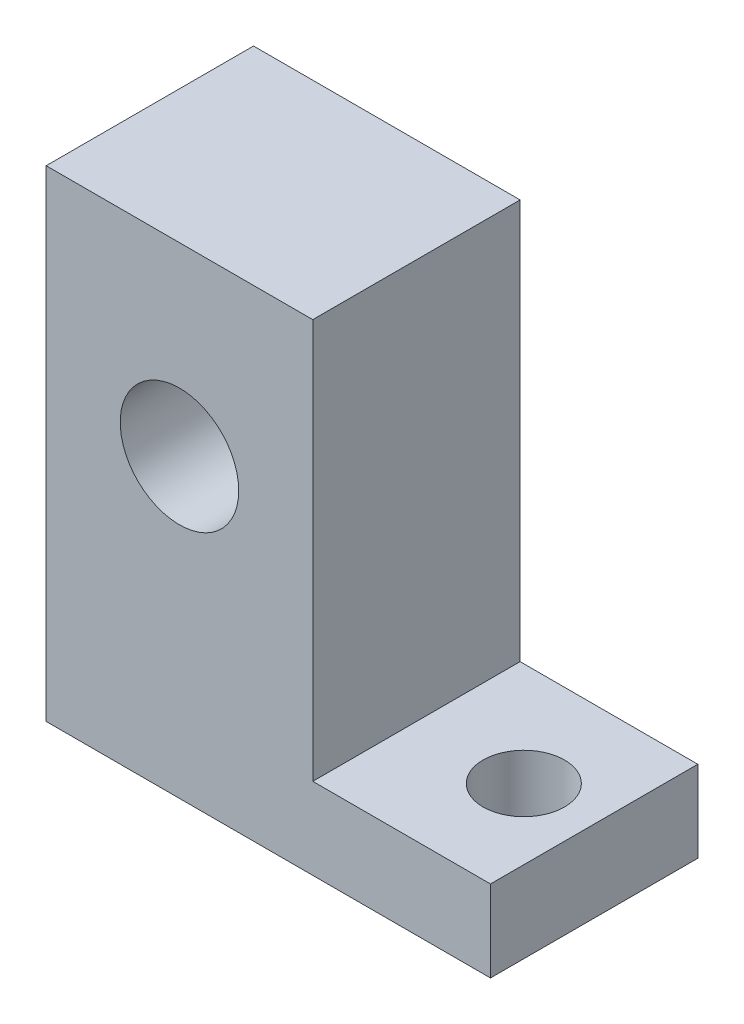
ISO-10303-21;
HEADER;
FILE_DESCRIPTION(('STEP AP214'),'2;1');
FILE_NAME('part.step','',(''),(''),'','','');
FILE_SCHEMA(('AUTOMOTIVE_DESIGN { 1 0 10303 214 1 1 1 1 }'));
ENDSEC;
DATA;
#1=APPLICATION_CONTEXT('core data for automotive mechanical design processes');
#2=APPLICATION_PROTOCOL_DEFINITION('international standard','automotive_design',2000,#1);
#3=PRODUCT_CONTEXT('',#1,'mechanical');
#4=PRODUCT('Part','Part','',(#3));
#5=PRODUCT_RELATED_PRODUCT_CATEGORY('part','',(#4));
#6=PRODUCT_DEFINITION_FORMATION('','',#4);
#7=PRODUCT_DEFINITION_CONTEXT('part definition',#1,'design');
#8=PRODUCT_DEFINITION('design','',#6,#7);
#9=PRODUCT_DEFINITION_SHAPE('','',#8);
#10=(LENGTH_UNIT() NAMED_UNIT(*) SI_UNIT(.MILLI.,.METRE.));
#11=(NAMED_UNIT(*) PLANE_ANGLE_UNIT() SI_UNIT($,.RADIAN.));
#12=(NAMED_UNIT(*) SI_UNIT($,.STERADIAN.) SOLID_ANGLE_UNIT());
#13=UNCERTAINTY_MEASURE_WITH_UNIT(LENGTH_MEASURE(1.E-05),#10,'distance_accuracy_value','');
#14=(GEOMETRIC_REPRESENTATION_CONTEXT(3) GLOBAL_UNCERTAINTY_ASSIGNED_CONTEXT((#13)) GLOBAL_UNIT_ASSIGNED_CONTEXT((#10,
#11,#12)) REPRESENTATION_CONTEXT('',''));
#15=CARTESIAN_POINT('',(0.,0.,0.));
#16=DIRECTION('',(0.,0.,1.));
#17=DIRECTION('',(1.,0.,0.));
#18=AXIS2_PLACEMENT_3D('',#15,#16,#17);
#19=CARTESIAN_POINT('',(0.,0.,14.));
#20=DIRECTION('',(0.,0.,-1.));
#21=DIRECTION('',(-1.,0.,0.));
#22=AXIS2_PLACEMENT_3D('',#19,#20,#21);
#23=PLANE('',#22);
#24=DIRECTION('',(0.,-1.,0.));
#25=VECTOR('',#24,1.);
#26=CARTESIAN_POINT('',(-9.,-10.75,14.));
#27=LINE('',#26,#25);
#28=CARTESIAN_POINT('',(-9.,16.25,14.));
#29=VERTEX_POINT('',#28);
#30=CARTESIAN_POINT('',(-9.,-16.25,14.));
#31=VERTEX_POINT('',#30);
#32=EDGE_CURVE('E111',#29,#31,#27,.T.);
#33=ORIENTED_EDGE('',*,*,#32,.T.);
#34=DIRECTION('',(1.,0.,0.));
#35=VECTOR('',#34,1.);
#36=CARTESIAN_POINT('',(-21.,-16.25,14.));
#37=LINE('',#36,#35);
#38=CARTESIAN_POINT('',(21.,-16.25,14.));
#39=VERTEX_POINT('',#38);
#40=EDGE_CURVE('E85',#31,#39,#37,.T.);
#41=ORIENTED_EDGE('',*,*,#40,.T.);
#42=DIRECTION('',(0.,1.,0.));
#43=VECTOR('',#42,1.);
#44=CARTESIAN_POINT('',(21.,-16.25,14.));
#45=LINE('',#44,#43);
#46=CARTESIAN_POINT('',(21.,-10.75,14.));
#47=VERTEX_POINT('',#46);
#48=EDGE_CURVE('E98',#39,#47,#45,.T.);
#49=ORIENTED_EDGE('',*,*,#48,.T.);
#50=DIRECTION('',(-1.,0.,0.));
#51=VECTOR('',#50,1.);
#52=CARTESIAN_POINT('',(21.,-10.75,14.));
#53=LINE('',#52,#51);
#54=CARTESIAN_POINT('',(8.99999999999999,-10.75,14.));
#55=VERTEX_POINT('',#54);
#56=EDGE_CURVE('E92',#47,#55,#53,.T.);
#57=ORIENTED_EDGE('',*,*,#56,.T.);
#58=DIRECTION('',(0.,1.,0.));
#59=VECTOR('',#58,1.);
#60=CARTESIAN_POINT('',(8.99999999999999,-10.75,14.));
#61=LINE('',#60,#59);
#62=CARTESIAN_POINT('',(8.99999999999999,16.25,14.));
#63=VERTEX_POINT('',#62);
#64=EDGE_CURVE('E96',#55,#63,#61,.T.);
#65=ORIENTED_EDGE('',*,*,#64,.T.);
#66=DIRECTION('',(-1.,0.,0.));
#67=VECTOR('',#66,1.);
#68=CARTESIAN_POINT('',(-9.,16.25,14.));
#69=LINE('',#68,#67);
#70=EDGE_CURVE('E51',#63,#29,#69,.T.);
#71=ORIENTED_EDGE('',*,*,#70,.T.);
#72=EDGE_LOOP('',(#33,#41,#49,#57,#65,#71));
#73=FACE_BOUND('',#72,.T.);
#74=CARTESIAN_POINT('',(0.,3.74999999999999,14.));
#75=DIRECTION('',(0.,0.,1.));
#76=DIRECTION('',(1.,0.,0.));
#77=AXIS2_PLACEMENT_3D('',#74,#75,#76);
#78=CIRCLE('',#77,4.);
#79=CARTESIAN_POINT('',(3.99999999999999,3.74999999999999,14.));
#80=VERTEX_POINT('',#79);
#81=EDGE_CURVE('E120',#80,#80,#78,.T.);
#82=ORIENTED_EDGE('',*,*,#81,.F.);
#83=EDGE_LOOP('',(#82));
#84=FACE_BOUND('',#83,.T.);
#85=ADVANCED_FACE('F34',(#73,#84),#23,.F.);
#86=CARTESIAN_POINT('',(0.,0.,0.));
#87=DIRECTION('',(0.,0.,-1.));
#88=DIRECTION('',(-1.,0.,0.));
#89=AXIS2_PLACEMENT_3D('',#86,#87,#88);
#90=PLANE('',#89);
#91=DIRECTION('',(1.,0.,0.));
#92=VECTOR('',#91,1.);
#93=CARTESIAN_POINT('',(-21.,-16.25,0.));
#94=LINE('',#93,#92);
#95=CARTESIAN_POINT('',(-9.,-16.25,0.));
#96=VERTEX_POINT('',#95);
#97=CARTESIAN_POINT('',(21.,-16.25,0.));
#98=VERTEX_POINT('',#97);
#99=EDGE_CURVE('E117',#96,#98,#94,.T.);
#100=ORIENTED_EDGE('',*,*,#99,.F.);
#101=DIRECTION('',(0.,-1.,0.));
#102=VECTOR('',#101,1.);
#103=CARTESIAN_POINT('',(-9.,-10.75,0.));
#104=LINE('',#103,#102);
#105=CARTESIAN_POINT('',(-9.,16.25,0.));
#106=VERTEX_POINT('',#105);
#107=EDGE_CURVE('E125',#106,#96,#104,.T.);
#108=ORIENTED_EDGE('',*,*,#107,.F.);
#109=DIRECTION('',(-1.,0.,0.));
#110=VECTOR('',#109,1.);
#111=CARTESIAN_POINT('',(-9.,16.25,0.));
#112=LINE('',#111,#110);
#113=CARTESIAN_POINT('',(8.99999999999999,16.25,0.));
#114=VERTEX_POINT('',#113);
#115=EDGE_CURVE('E78',#114,#106,#112,.T.);
#116=ORIENTED_EDGE('',*,*,#115,.F.);
#117=DIRECTION('',(0.,1.,0.));
#118=VECTOR('',#117,1.);
#119=CARTESIAN_POINT('',(8.99999999999999,-10.75,0.));
#120=LINE('',#119,#118);
#121=CARTESIAN_POINT('',(8.99999999999999,-10.75,0.));
#122=VERTEX_POINT('',#121);
#123=EDGE_CURVE('E72',#122,#114,#120,.T.);
#124=ORIENTED_EDGE('',*,*,#123,.F.);
#125=DIRECTION('',(-1.,0.,0.));
#126=VECTOR('',#125,1.);
#127=CARTESIAN_POINT('',(21.,-10.75,0.));
#128=LINE('',#127,#126);
#129=CARTESIAN_POINT('',(21.,-10.75,0.));
#130=VERTEX_POINT('',#129);
#131=EDGE_CURVE('E106',#130,#122,#128,.T.);
#132=ORIENTED_EDGE('',*,*,#131,.F.);
#133=DIRECTION('',(0.,1.,0.));
#134=VECTOR('',#133,1.);
#135=CARTESIAN_POINT('',(21.,-16.25,0.));
#136=LINE('',#135,#134);
#137=EDGE_CURVE('E119',#98,#130,#136,.T.);
#138=ORIENTED_EDGE('',*,*,#137,.F.);
#139=EDGE_LOOP('',(#100,#108,#116,#124,#132,#138));
#140=FACE_BOUND('',#139,.T.);
#141=CARTESIAN_POINT('',(0.,3.74999999999999,0.));
#142=DIRECTION('',(0.,0.,1.));
#143=DIRECTION('',(1.,0.,0.));
#144=AXIS2_PLACEMENT_3D('',#141,#142,#143);
#145=CIRCLE('',#144,4.);
#146=CARTESIAN_POINT('',(3.99999999999999,3.74999999999999,0.));
#147=VERTEX_POINT('',#146);
#148=EDGE_CURVE('E152',#147,#147,#145,.T.);
#149=ORIENTED_EDGE('',*,*,#148,.T.);
#150=EDGE_LOOP('',(#149));
#151=FACE_BOUND('',#150,.T.);
#152=ADVANCED_FACE('F133',(#140,#151),#90,.T.);
#153=CARTESIAN_POINT('',(-21.,-16.25,14.));
#154=DIRECTION('',(0.,1.,0.));
#155=DIRECTION('',(0.,0.,1.));
#156=AXIS2_PLACEMENT_3D('',#153,#154,#155);
#157=PLANE('',#156);
#158=CARTESIAN_POINT('',(16.25,-16.25,7.00000000000001));
#159=DIRECTION('',(0.,1.,0.));
#160=DIRECTION('',(0.,0.,1.));
#161=AXIS2_PLACEMENT_3D('',#158,#159,#160);
#162=CIRCLE('',#161,2.75);
#163=CARTESIAN_POINT('',(16.25,-16.25,9.75));
#164=VERTEX_POINT('',#163);
#165=EDGE_CURVE('E147',#164,#164,#162,.T.);
#166=ORIENTED_EDGE('',*,*,#165,.T.);
#167=EDGE_LOOP('',(#166));
#168=FACE_BOUND('',#167,.T.);
#169=ORIENTED_EDGE('',*,*,#40,.F.);
#170=DIRECTION('',(0.,0.,-1.));
#171=VECTOR('',#170,1.);
#172=CARTESIAN_POINT('',(-9.,-16.25,14.));
#173=LINE('',#172,#171);
#174=EDGE_CURVE('E142',#31,#96,#173,.T.);
#175=ORIENTED_EDGE('',*,*,#174,.T.);
#176=ORIENTED_EDGE('',*,*,#99,.T.);
#177=DIRECTION('',(0.,0.,-1.));
#178=VECTOR('',#177,1.);
#179=CARTESIAN_POINT('',(21.,-16.25,14.));
#180=LINE('',#179,#178);
#181=EDGE_CURVE('E11',#39,#98,#180,.T.);
#182=ORIENTED_EDGE('',*,*,#181,.F.);
#183=EDGE_LOOP('',(#169,#175,#176,#182));
#184=FACE_BOUND('',#183,.T.);
#185=ADVANCED_FACE('F36',(#168,#184),#157,.F.);
#186=CARTESIAN_POINT('',(21.,-16.25,14.));
#187=DIRECTION('',(-1.,0.,0.));
#188=DIRECTION('',(0.,-1.,0.));
#189=AXIS2_PLACEMENT_3D('',#186,#187,#188);
#190=PLANE('',#189);
#191=ORIENTED_EDGE('',*,*,#137,.T.);
#192=DIRECTION('',(0.,0.,-1.));
#193=VECTOR('',#192,1.);
#194=CARTESIAN_POINT('',(21.,-10.75,14.));
#195=LINE('',#194,#193);
#196=EDGE_CURVE('E43',#47,#130,#195,.T.);
#197=ORIENTED_EDGE('',*,*,#196,.F.);
#198=ORIENTED_EDGE('',*,*,#48,.F.);
#199=ORIENTED_EDGE('',*,*,#181,.T.);
#200=EDGE_LOOP('',(#191,#197,#198,#199));
#201=FACE_BOUND('',#200,.T.);
#202=ADVANCED_FACE('F184',(#201),#190,.F.);
#203=CARTESIAN_POINT('',(21.,-10.75,14.));
#204=DIRECTION('',(0.,-1.,0.));
#205=DIRECTION('',(0.,0.,-1.));
#206=AXIS2_PLACEMENT_3D('',#203,#204,#205);
#207=PLANE('',#206);
#208=CARTESIAN_POINT('',(16.25,-10.75,7.00000000000001));
#209=DIRECTION('',(0.,1.,0.));
#210=DIRECTION('',(0.,0.,1.));
#211=AXIS2_PLACEMENT_3D('',#208,#209,#210);
#212=CIRCLE('',#211,2.75);
#213=CARTESIAN_POINT('',(16.25,-10.75,9.75));
#214=VERTEX_POINT('',#213);
#215=EDGE_CURVE('E144',#214,#214,#212,.T.);
#216=ORIENTED_EDGE('',*,*,#215,.F.);
#217=EDGE_LOOP('',(#216));
#218=FACE_BOUND('',#217,.T.);
#219=ORIENTED_EDGE('',*,*,#131,.T.);
#220=DIRECTION('',(0.,0.,-1.));
#221=VECTOR('',#220,1.);
#222=CARTESIAN_POINT('',(8.99999999999999,-10.75,14.));
#223=LINE('',#222,#221);
#224=EDGE_CURVE('E103',#55,#122,#223,.T.);
#225=ORIENTED_EDGE('',*,*,#224,.F.);
#226=ORIENTED_EDGE('',*,*,#56,.F.);
#227=ORIENTED_EDGE('',*,*,#196,.T.);
#228=EDGE_LOOP('',(#219,#225,#226,#227));
#229=FACE_BOUND('',#228,.T.);
#230=ADVANCED_FACE('F104',(#218,#229),#207,.F.);
#231=CARTESIAN_POINT('',(8.99999999999999,-10.75,14.));
#232=DIRECTION('',(-1.,0.,0.));
#233=DIRECTION('',(0.,0.,1.));
#234=AXIS2_PLACEMENT_3D('',#231,#232,#233);
#235=PLANE('',#234);
#236=ORIENTED_EDGE('',*,*,#123,.T.);
#237=DIRECTION('',(0.,0.,-1.));
#238=VECTOR('',#237,1.);
#239=CARTESIAN_POINT('',(8.99999999999999,16.25,14.));
#240=LINE('',#239,#238);
#241=EDGE_CURVE('E107',#63,#114,#240,.T.);
#242=ORIENTED_EDGE('',*,*,#241,.F.);
#243=ORIENTED_EDGE('',*,*,#64,.F.);
#244=ORIENTED_EDGE('',*,*,#224,.T.);
#245=EDGE_LOOP('',(#236,#242,#243,#244));
#246=FACE_BOUND('',#245,.T.);
#247=ADVANCED_FACE('F109',(#246),#235,.F.);
#248=CARTESIAN_POINT('',(-9.,16.25,14.));
#249=DIRECTION('',(0.,-1.,0.));
#250=DIRECTION('',(0.,0.,-1.));
#251=AXIS2_PLACEMENT_3D('',#248,#249,#250);
#252=PLANE('',#251);
#253=ORIENTED_EDGE('',*,*,#115,.T.);
#254=DIRECTION('',(0.,0.,-1.));
#255=VECTOR('',#254,1.);
#256=CARTESIAN_POINT('',(-9.,16.25,14.));
#257=LINE('',#256,#255);
#258=EDGE_CURVE('E116',#29,#106,#257,.T.);
#259=ORIENTED_EDGE('',*,*,#258,.F.);
#260=ORIENTED_EDGE('',*,*,#70,.F.);
#261=ORIENTED_EDGE('',*,*,#241,.T.);
#262=EDGE_LOOP('',(#253,#259,#260,#261));
#263=FACE_BOUND('',#262,.T.);
#264=ADVANCED_FACE('F170',(#263),#252,.F.);
#265=CARTESIAN_POINT('',(-9.,-10.75,14.));
#266=DIRECTION('',(1.,0.,0.));
#267=DIRECTION('',(0.,0.,-1.));
#268=AXIS2_PLACEMENT_3D('',#265,#266,#267);
#269=PLANE('',#268);
#270=ORIENTED_EDGE('',*,*,#107,.T.);
#271=ORIENTED_EDGE('',*,*,#174,.F.);
#272=ORIENTED_EDGE('',*,*,#32,.F.);
#273=ORIENTED_EDGE('',*,*,#258,.T.);
#274=EDGE_LOOP('',(#270,#271,#272,#273));
#275=FACE_BOUND('',#274,.T.);
#276=ADVANCED_FACE('F140',(#275),#269,.F.);
#277=CARTESIAN_POINT('',(0.,3.74999999999999,14.));
#278=DIRECTION('',(0.,0.,-1.));
#279=DIRECTION('',(-1.,0.,0.));
#280=AXIS2_PLACEMENT_3D('',#277,#278,#279);
#281=CYLINDRICAL_SURFACE('',#280,4.);
#282=ORIENTED_EDGE('',*,*,#81,.T.);
#283=EDGE_LOOP('',(#282));
#284=FACE_BOUND('',#283,.T.);
#285=ORIENTED_EDGE('',*,*,#148,.F.);
#286=EDGE_LOOP('',(#285));
#287=FACE_BOUND('',#286,.T.);
#288=ADVANCED_FACE('F159',(#284,#287),#281,.F.);
#289=CARTESIAN_POINT('',(16.25,-24.75,7.00000000000001));
#290=DIRECTION('',(0.,1.,0.));
#291=DIRECTION('',(0.,0.,1.));
#292=AXIS2_PLACEMENT_3D('',#289,#290,#291);
#293=CYLINDRICAL_SURFACE('',#292,2.75);
#294=ORIENTED_EDGE('',*,*,#215,.T.);
#295=EDGE_LOOP('',(#294));
#296=FACE_BOUND('',#295,.T.);
#297=ORIENTED_EDGE('',*,*,#165,.F.);
#298=EDGE_LOOP('',(#297));
#299=FACE_BOUND('',#298,.T.);
#300=ADVANCED_FACE('F161',(#296,#299),#293,.F.);
#301=CLOSED_SHELL('',(#85,#152,#185,#202,#230,#247,#264,#276,#288,#300));
#302=MANIFOLD_SOLID_BREP('B2',#301);
#303=ADVANCED_BREP_SHAPE_REPRESENTATION('',(#18,#302),#14);
#304=SHAPE_DEFINITION_REPRESENTATION(#9,#303);
ENDSEC;
END-ISO-10303-21;
